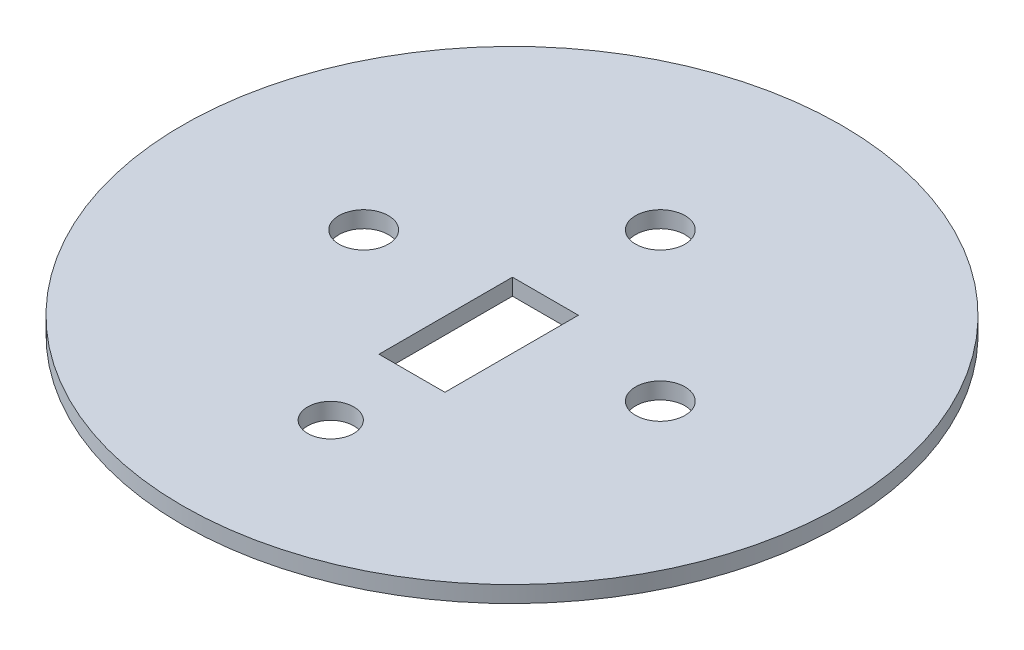
ISO-10303-21;
HEADER;
FILE_DESCRIPTION(('STEP AP214'),'2;1');
FILE_NAME('part.step','',(''),(''),'','','');
FILE_SCHEMA(('AUTOMOTIVE_DESIGN { 1 0 10303 214 1 1 1 1 }'));
ENDSEC;
DATA;
#1=APPLICATION_CONTEXT('core data for automotive mechanical design processes');
#2=APPLICATION_PROTOCOL_DEFINITION('international standard','automotive_design',2000,#1);
#3=PRODUCT_CONTEXT('',#1,'mechanical');
#4=PRODUCT('Part','Part','',(#3));
#5=PRODUCT_RELATED_PRODUCT_CATEGORY('part','',(#4));
#6=PRODUCT_DEFINITION_FORMATION('','',#4);
#7=PRODUCT_DEFINITION_CONTEXT('part definition',#1,'design');
#8=PRODUCT_DEFINITION('design','',#6,#7);
#9=PRODUCT_DEFINITION_SHAPE('','',#8);
#10=(LENGTH_UNIT() NAMED_UNIT(*) SI_UNIT(.MILLI.,.METRE.));
#11=(NAMED_UNIT(*) PLANE_ANGLE_UNIT() SI_UNIT($,.RADIAN.));
#12=(NAMED_UNIT(*) SI_UNIT($,.STERADIAN.) SOLID_ANGLE_UNIT());
#13=UNCERTAINTY_MEASURE_WITH_UNIT(LENGTH_MEASURE(1.E-05),#10,'distance_accuracy_value','');
#14=(GEOMETRIC_REPRESENTATION_CONTEXT(3) GLOBAL_UNCERTAINTY_ASSIGNED_CONTEXT((#13)) GLOBAL_UNIT_ASSIGNED_CONTEXT((#10,
#11,#12)) REPRESENTATION_CONTEXT('',''));
#15=CARTESIAN_POINT('',(0.,0.,0.));
#16=DIRECTION('',(0.,0.,1.));
#17=DIRECTION('',(1.,0.,0.));
#18=AXIS2_PLACEMENT_3D('',#15,#16,#17);
#19=CARTESIAN_POINT('',(0.,2.5,0.));
#20=DIRECTION('',(0.,-1.,0.));
#21=DIRECTION('',(0.,0.,-1.));
#22=AXIS2_PLACEMENT_3D('',#19,#20,#21);
#23=CYLINDRICAL_SURFACE('',#22,100.);
#24=CARTESIAN_POINT('',(0.,2.5,0.));
#25=DIRECTION('',(0.,1.,0.));
#26=DIRECTION('',(0.,0.,1.));
#27=AXIS2_PLACEMENT_3D('',#24,#25,#26);
#28=CIRCLE('',#27,100.);
#29=CARTESIAN_POINT('',(0.,2.5,100.));
#30=VERTEX_POINT('',#29);
#31=EDGE_CURVE('E11',#30,#30,#28,.T.);
#32=ORIENTED_EDGE('',*,*,#31,.F.);
#33=EDGE_LOOP('',(#32));
#34=FACE_BOUND('',#33,.T.);
#35=CARTESIAN_POINT('',(0.,-2.5,0.));
#36=DIRECTION('',(0.,1.,0.));
#37=DIRECTION('',(0.,0.,1.));
#38=AXIS2_PLACEMENT_3D('',#35,#36,#37);
#39=CIRCLE('',#38,100.);
#40=CARTESIAN_POINT('',(0.,-2.5,100.));
#41=VERTEX_POINT('',#40);
#42=EDGE_CURVE('E37',#41,#41,#39,.T.);
#43=ORIENTED_EDGE('',*,*,#42,.T.);
#44=EDGE_LOOP('',(#43));
#45=FACE_BOUND('',#44,.T.);
#46=ADVANCED_FACE('F34',(#34,#45),#23,.T.);
#47=CARTESIAN_POINT('',(0.,2.5,0.));
#48=DIRECTION('',(0.,1.,0.));
#49=DIRECTION('',(0.,0.,1.));
#50=AXIS2_PLACEMENT_3D('',#47,#48,#49);
#51=PLANE('',#50);
#52=CARTESIAN_POINT('',(-45.,2.5,0.));
#53=DIRECTION('',(0.,1.,0.));
#54=DIRECTION('',(0.,0.,1.));
#55=AXIS2_PLACEMENT_3D('',#52,#53,#54);
#56=CIRCLE('',#55,7.5);
#57=CARTESIAN_POINT('',(-45.,2.5,7.49999999999999));
#58=VERTEX_POINT('',#57);
#59=EDGE_CURVE('E137',#58,#58,#56,.T.);
#60=ORIENTED_EDGE('',*,*,#59,.F.);
#61=EDGE_LOOP('',(#60));
#62=FACE_BOUND('',#61,.T.);
#63=CARTESIAN_POINT('',(0.,2.5,-45.));
#64=DIRECTION('',(0.,1.,0.));
#65=DIRECTION('',(0.,0.,1.));
#66=AXIS2_PLACEMENT_3D('',#63,#64,#65);
#67=CIRCLE('',#66,7.5);
#68=CARTESIAN_POINT('',(0.,2.5,-37.5));
#69=VERTEX_POINT('',#68);
#70=EDGE_CURVE('E470',#69,#69,#67,.T.);
#71=ORIENTED_EDGE('',*,*,#70,.F.);
#72=EDGE_LOOP('',(#71));
#73=FACE_BOUND('',#72,.T.);
#74=CARTESIAN_POINT('',(45.,2.5,0.));
#75=DIRECTION('',(0.,1.,0.));
#76=DIRECTION('',(0.,0.,1.));
#77=AXIS2_PLACEMENT_3D('',#74,#75,#76);
#78=CIRCLE('',#77,7.5);
#79=CARTESIAN_POINT('',(45.,2.5,7.5));
#80=VERTEX_POINT('',#79);
#81=EDGE_CURVE('E457',#80,#80,#78,.T.);
#82=ORIENTED_EDGE('',*,*,#81,.F.);
#83=EDGE_LOOP('',(#82));
#84=FACE_BOUND('',#83,.T.);
#85=CARTESIAN_POINT('',(0.,2.5,55.));
#86=DIRECTION('',(0.,1.,0.));
#87=DIRECTION('',(0.,0.,1.));
#88=AXIS2_PLACEMENT_3D('',#85,#86,#87);
#89=CIRCLE('',#88,7.);
#90=CARTESIAN_POINT('',(0.,2.5,62.));
#91=VERTEX_POINT('',#90);
#92=EDGE_CURVE('E453',#91,#91,#89,.T.);
#93=ORIENTED_EDGE('',*,*,#92,.F.);
#94=EDGE_LOOP('',(#93));
#95=FACE_BOUND('',#94,.T.);
#96=DIRECTION('',(1.,0.,0.));
#97=VECTOR('',#96,1.);
#98=CARTESIAN_POINT('',(0.,2.5,30.36));
#99=LINE('',#98,#97);
#100=CARTESIAN_POINT('',(-9.99999999999999,2.5,30.36));
#101=VERTEX_POINT('',#100);
#102=CARTESIAN_POINT('',(10.,2.5,30.36));
#103=VERTEX_POINT('',#102);
#104=EDGE_CURVE('E157',#101,#103,#99,.T.);
#105=ORIENTED_EDGE('',*,*,#104,.F.);
#106=DIRECTION('',(0.,0.,1.));
#107=VECTOR('',#106,1.);
#108=CARTESIAN_POINT('',(-9.99999999999999,2.5,0.));
#109=LINE('',#108,#107);
#110=CARTESIAN_POINT('',(-9.99999999999999,2.5,-10.14));
#111=VERTEX_POINT('',#110);
#112=EDGE_CURVE('E150',#111,#101,#109,.T.);
#113=ORIENTED_EDGE('',*,*,#112,.F.);
#114=DIRECTION('',(-1.,0.,0.));
#115=VECTOR('',#114,1.);
#116=CARTESIAN_POINT('',(0.,2.5,-10.14));
#117=LINE('',#116,#115);
#118=CARTESIAN_POINT('',(10.,2.5,-10.14));
#119=VERTEX_POINT('',#118);
#120=EDGE_CURVE('E128',#119,#111,#117,.T.);
#121=ORIENTED_EDGE('',*,*,#120,.F.);
#122=DIRECTION('',(0.,0.,-1.));
#123=VECTOR('',#122,1.);
#124=CARTESIAN_POINT('',(10.,2.5,0.));
#125=LINE('',#124,#123);
#126=EDGE_CURVE('E155',#103,#119,#125,.T.);
#127=ORIENTED_EDGE('',*,*,#126,.F.);
#128=EDGE_LOOP('',(#105,#113,#121,#127));
#129=FACE_BOUND('',#128,.T.);
#130=ORIENTED_EDGE('',*,*,#31,.T.);
#131=EDGE_LOOP('',(#130));
#132=FACE_BOUND('',#131,.T.);
#133=ADVANCED_FACE('F249',(#62,#73,#84,#95,#129,#132),#51,.T.);
#134=CARTESIAN_POINT('',(0.,-2.5,0.));
#135=DIRECTION('',(0.,1.,0.));
#136=DIRECTION('',(0.,0.,1.));
#137=AXIS2_PLACEMENT_3D('',#134,#135,#136);
#138=PLANE('',#137);
#139=CARTESIAN_POINT('',(-45.,-2.5,0.));
#140=DIRECTION('',(0.,-1.,0.));
#141=DIRECTION('',(0.,0.,-1.));
#142=AXIS2_PLACEMENT_3D('',#139,#140,#141);
#143=CIRCLE('',#142,7.5);
#144=CARTESIAN_POINT('',(-45.,-2.5,-7.50000000000001));
#145=VERTEX_POINT('',#144);
#146=EDGE_CURVE('E452',#145,#145,#143,.T.);
#147=ORIENTED_EDGE('',*,*,#146,.F.);
#148=EDGE_LOOP('',(#147));
#149=FACE_BOUND('',#148,.T.);
#150=CARTESIAN_POINT('',(0.,-2.5,-45.));
#151=DIRECTION('',(0.,-1.,0.));
#152=DIRECTION('',(0.,0.,-1.));
#153=AXIS2_PLACEMENT_3D('',#150,#151,#152);
#154=CIRCLE('',#153,7.5);
#155=CARTESIAN_POINT('',(0.,-2.5,-52.5));
#156=VERTEX_POINT('',#155);
#157=EDGE_CURVE('E454',#156,#156,#154,.T.);
#158=ORIENTED_EDGE('',*,*,#157,.F.);
#159=EDGE_LOOP('',(#158));
#160=FACE_BOUND('',#159,.T.);
#161=CARTESIAN_POINT('',(45.,-2.5,0.));
#162=DIRECTION('',(0.,-1.,0.));
#163=DIRECTION('',(0.,0.,-1.));
#164=AXIS2_PLACEMENT_3D('',#161,#162,#163);
#165=CIRCLE('',#164,7.5);
#166=CARTESIAN_POINT('',(45.,-2.5,-7.5));
#167=VERTEX_POINT('',#166);
#168=EDGE_CURVE('E460',#167,#167,#165,.T.);
#169=ORIENTED_EDGE('',*,*,#168,.F.);
#170=EDGE_LOOP('',(#169));
#171=FACE_BOUND('',#170,.T.);
#172=CARTESIAN_POINT('',(0.,-2.5,55.));
#173=DIRECTION('',(0.,-1.,0.));
#174=DIRECTION('',(0.,0.,-1.));
#175=AXIS2_PLACEMENT_3D('',#172,#173,#174);
#176=CIRCLE('',#175,7.);
#177=CARTESIAN_POINT('',(0.,-2.5,48.));
#178=VERTEX_POINT('',#177);
#179=EDGE_CURVE('E465',#178,#178,#176,.T.);
#180=ORIENTED_EDGE('',*,*,#179,.F.);
#181=EDGE_LOOP('',(#180));
#182=FACE_BOUND('',#181,.T.);
#183=DIRECTION('',(0.,0.,-1.));
#184=VECTOR('',#183,1.);
#185=CARTESIAN_POINT('',(-9.99999999999999,-2.5,-10.14));
#186=LINE('',#185,#184);
#187=CARTESIAN_POINT('',(-9.99999999999999,-2.5,30.36));
#188=VERTEX_POINT('',#187);
#189=CARTESIAN_POINT('',(-9.99999999999999,-2.5,-10.14));
#190=VERTEX_POINT('',#189);
#191=EDGE_CURVE('E134',#188,#190,#186,.T.);
#192=ORIENTED_EDGE('',*,*,#191,.F.);
#193=DIRECTION('',(-1.,0.,0.));
#194=VECTOR('',#193,1.);
#195=CARTESIAN_POINT('',(0.,-2.5,30.36));
#196=LINE('',#195,#194);
#197=CARTESIAN_POINT('',(10.,-2.5,30.36));
#198=VERTEX_POINT('',#197);
#199=EDGE_CURVE('E56',#198,#188,#196,.T.);
#200=ORIENTED_EDGE('',*,*,#199,.F.);
#201=DIRECTION('',(0.,0.,1.));
#202=VECTOR('',#201,1.);
#203=CARTESIAN_POINT('',(10.,-2.5,30.36));
#204=LINE('',#203,#202);
#205=CARTESIAN_POINT('',(10.,-2.5,-10.14));
#206=VERTEX_POINT('',#205);
#207=EDGE_CURVE('E142',#206,#198,#204,.T.);
#208=ORIENTED_EDGE('',*,*,#207,.F.);
#209=DIRECTION('',(1.,0.,0.));
#210=VECTOR('',#209,1.);
#211=CARTESIAN_POINT('',(10.,-2.5,-10.14));
#212=LINE('',#211,#210);
#213=EDGE_CURVE('E125',#190,#206,#212,.T.);
#214=ORIENTED_EDGE('',*,*,#213,.F.);
#215=EDGE_LOOP('',(#192,#200,#208,#214));
#216=FACE_BOUND('',#215,.T.);
#217=DIRECTION('',(1.,0.,0.));
#218=VECTOR('',#217,1.);
#219=CARTESIAN_POINT('',(65.,-2.5,-50.));
#220=LINE('',#219,#218);
#221=CARTESIAN_POINT('',(55.,-2.5,-50.));
#222=VERTEX_POINT('',#221);
#223=CARTESIAN_POINT('',(65.,-2.5,-50.));
#224=VERTEX_POINT('',#223);
#225=EDGE_CURVE('E175',#222,#224,#220,.T.);
#226=ORIENTED_EDGE('',*,*,#225,.F.);
#227=DIRECTION('',(0.,0.,-1.));
#228=VECTOR('',#227,1.);
#229=CARTESIAN_POINT('',(55.,-2.5,-50.));
#230=LINE('',#229,#228);
#231=CARTESIAN_POINT('',(55.,-2.5,50.));
#232=VERTEX_POINT('',#231);
#233=EDGE_CURVE('E173',#232,#222,#230,.T.);
#234=ORIENTED_EDGE('',*,*,#233,.F.);
#235=DIRECTION('',(-1.,0.,0.));
#236=VECTOR('',#235,1.);
#237=CARTESIAN_POINT('',(55.,-2.5,50.));
#238=LINE('',#237,#236);
#239=CARTESIAN_POINT('',(65.,-2.5,50.));
#240=VERTEX_POINT('',#239);
#241=EDGE_CURVE('E164',#240,#232,#238,.T.);
#242=ORIENTED_EDGE('',*,*,#241,.F.);
#243=DIRECTION('',(0.,0.,1.));
#244=VECTOR('',#243,1.);
#245=CARTESIAN_POINT('',(65.,-2.5,50.));
#246=LINE('',#245,#244);
#247=EDGE_CURVE('E179',#224,#240,#246,.T.);
#248=ORIENTED_EDGE('',*,*,#247,.F.);
#249=EDGE_LOOP('',(#226,#234,#242,#248));
#250=FACE_BOUND('',#249,.T.);
#251=DIRECTION('',(0.,0.,-1.));
#252=VECTOR('',#251,1.);
#253=CARTESIAN_POINT('',(-65.,-2.5,0.));
#254=LINE('',#253,#252);
#255=CARTESIAN_POINT('',(-65.,-2.5,50.));
#256=VERTEX_POINT('',#255);
#257=CARTESIAN_POINT('',(-65.,-2.5,-50.));
#258=VERTEX_POINT('',#257);
#259=EDGE_CURVE('E159',#256,#258,#254,.T.);
#260=ORIENTED_EDGE('',*,*,#259,.F.);
#261=DIRECTION('',(-1.,0.,0.));
#262=VECTOR('',#261,1.);
#263=CARTESIAN_POINT('',(-55.,-2.5,50.));
#264=LINE('',#263,#262);
#265=CARTESIAN_POINT('',(-55.,-2.5,50.));
#266=VERTEX_POINT('',#265);
#267=EDGE_CURVE('E195',#266,#256,#264,.T.);
#268=ORIENTED_EDGE('',*,*,#267,.F.);
#269=DIRECTION('',(0.,0.,1.));
#270=VECTOR('',#269,1.);
#271=CARTESIAN_POINT('',(-55.,-2.5,-50.));
#272=LINE('',#271,#270);
#273=CARTESIAN_POINT('',(-55.,-2.5,-50.));
#274=VERTEX_POINT('',#273);
#275=EDGE_CURVE('E210',#274,#266,#272,.T.);
#276=ORIENTED_EDGE('',*,*,#275,.F.);
#277=DIRECTION('',(1.,0.,0.));
#278=VECTOR('',#277,1.);
#279=CARTESIAN_POINT('',(-65.,-2.5,-50.));
#280=LINE('',#279,#278);
#281=EDGE_CURVE('E207',#258,#274,#280,.T.);
#282=ORIENTED_EDGE('',*,*,#281,.F.);
#283=EDGE_LOOP('',(#260,#268,#276,#282));
#284=FACE_BOUND('',#283,.T.);
#285=ORIENTED_EDGE('',*,*,#42,.F.);
#286=EDGE_LOOP('',(#285));
#287=FACE_BOUND('',#286,.T.);
#288=ADVANCED_FACE('F139',(#149,#160,#171,#182,#216,#250,#284,#287),#138,.F.);
#289=CARTESIAN_POINT('',(-55.,0.,50.));
#290=DIRECTION('',(0.,0.,1.));
#291=DIRECTION('',(1.,0.,0.));
#292=AXIS2_PLACEMENT_3D('',#289,#290,#291);
#293=PLANE('',#292);
#294=ORIENTED_EDGE('',*,*,#267,.T.);
#295=DIRECTION('',(0.,-1.,0.));
#296=VECTOR('',#295,1.);
#297=CARTESIAN_POINT('',(-65.,0.,50.));
#298=LINE('',#297,#296);
#299=CARTESIAN_POINT('',(-65.,0.,50.));
#300=VERTEX_POINT('',#299);
#301=EDGE_CURVE('E176',#300,#256,#298,.T.);
#302=ORIENTED_EDGE('',*,*,#301,.F.);
#303=DIRECTION('',(-1.,0.,0.));
#304=VECTOR('',#303,1.);
#305=CARTESIAN_POINT('',(-55.,0.,50.));
#306=LINE('',#305,#304);
#307=CARTESIAN_POINT('',(-55.,0.,50.));
#308=VERTEX_POINT('',#307);
#309=EDGE_CURVE('E201',#308,#300,#306,.T.);
#310=ORIENTED_EDGE('',*,*,#309,.F.);
#311=DIRECTION('',(0.,-1.,0.));
#312=VECTOR('',#311,1.);
#313=CARTESIAN_POINT('',(-55.,0.,50.));
#314=LINE('',#313,#312);
#315=EDGE_CURVE('E216',#308,#266,#314,.T.);
#316=ORIENTED_EDGE('',*,*,#315,.T.);
#317=EDGE_LOOP('',(#294,#302,#310,#316));
#318=FACE_BOUND('',#317,.T.);
#319=ADVANCED_FACE('F240',(#318),#293,.F.);
#320=CARTESIAN_POINT('',(-55.,0.,-50.));
#321=DIRECTION('',(1.,0.,0.));
#322=DIRECTION('',(0.,0.,-1.));
#323=AXIS2_PLACEMENT_3D('',#320,#321,#322);
#324=PLANE('',#323);
#325=ORIENTED_EDGE('',*,*,#275,.T.);
#326=ORIENTED_EDGE('',*,*,#315,.F.);
#327=DIRECTION('',(0.,0.,1.));
#328=VECTOR('',#327,1.);
#329=CARTESIAN_POINT('',(-55.,0.,-50.));
#330=LINE('',#329,#328);
#331=CARTESIAN_POINT('',(-55.,0.,-50.));
#332=VERTEX_POINT('',#331);
#333=EDGE_CURVE('E198',#332,#308,#330,.T.);
#334=ORIENTED_EDGE('',*,*,#333,.F.);
#335=DIRECTION('',(0.,-1.,0.));
#336=VECTOR('',#335,1.);
#337=CARTESIAN_POINT('',(-55.,0.,-50.));
#338=LINE('',#337,#336);
#339=EDGE_CURVE('E218',#332,#274,#338,.T.);
#340=ORIENTED_EDGE('',*,*,#339,.T.);
#341=EDGE_LOOP('',(#325,#326,#334,#340));
#342=FACE_BOUND('',#341,.T.);
#343=ADVANCED_FACE('F234',(#342),#324,.F.);
#344=CARTESIAN_POINT('',(-65.,0.,-50.));
#345=DIRECTION('',(0.,0.,-1.));
#346=DIRECTION('',(-1.,0.,0.));
#347=AXIS2_PLACEMENT_3D('',#344,#345,#346);
#348=PLANE('',#347);
#349=ORIENTED_EDGE('',*,*,#281,.T.);
#350=ORIENTED_EDGE('',*,*,#339,.F.);
#351=DIRECTION('',(1.,0.,0.));
#352=VECTOR('',#351,1.);
#353=CARTESIAN_POINT('',(-65.,0.,-50.));
#354=LINE('',#353,#352);
#355=CARTESIAN_POINT('',(-65.,0.,-50.));
#356=VERTEX_POINT('',#355);
#357=EDGE_CURVE('E194',#356,#332,#354,.T.);
#358=ORIENTED_EDGE('',*,*,#357,.F.);
#359=DIRECTION('',(0.,-1.,0.));
#360=VECTOR('',#359,1.);
#361=CARTESIAN_POINT('',(-65.,0.,-50.));
#362=LINE('',#361,#360);
#363=EDGE_CURVE('E204',#356,#258,#362,.T.);
#364=ORIENTED_EDGE('',*,*,#363,.T.);
#365=EDGE_LOOP('',(#349,#350,#358,#364));
#366=FACE_BOUND('',#365,.T.);
#367=ADVANCED_FACE('F223',(#366),#348,.F.);
#368=CARTESIAN_POINT('',(-65.,0.,0.));
#369=DIRECTION('',(-1.,0.,0.));
#370=DIRECTION('',(0.,0.,1.));
#371=AXIS2_PLACEMENT_3D('',#368,#369,#370);
#372=PLANE('',#371);
#373=ORIENTED_EDGE('',*,*,#259,.T.);
#374=ORIENTED_EDGE('',*,*,#363,.F.);
#375=DIRECTION('',(0.,0.,-1.));
#376=VECTOR('',#375,1.);
#377=CARTESIAN_POINT('',(-65.,0.,50.));
#378=LINE('',#377,#376);
#379=EDGE_CURVE('E192',#300,#356,#378,.T.);
#380=ORIENTED_EDGE('',*,*,#379,.F.);
#381=ORIENTED_EDGE('',*,*,#301,.T.);
#382=EDGE_LOOP('',(#373,#374,#380,#381));
#383=FACE_BOUND('',#382,.T.);
#384=ADVANCED_FACE('F229',(#383),#372,.F.);
#385=CARTESIAN_POINT('',(0.,0.,0.));
#386=DIRECTION('',(0.,-1.,0.));
#387=DIRECTION('',(0.,0.,-1.));
#388=AXIS2_PLACEMENT_3D('',#385,#386,#387);
#389=PLANE('',#388);
#390=ORIENTED_EDGE('',*,*,#379,.T.);
#391=ORIENTED_EDGE('',*,*,#357,.T.);
#392=ORIENTED_EDGE('',*,*,#333,.T.);
#393=ORIENTED_EDGE('',*,*,#309,.T.);
#394=EDGE_LOOP('',(#390,#391,#392,#393));
#395=FACE_BOUND('',#394,.T.);
#396=ADVANCED_FACE('F238',(#395),#389,.T.);
#397=CARTESIAN_POINT('',(55.,0.,-50.));
#398=DIRECTION('',(-1.,0.,0.));
#399=DIRECTION('',(0.,0.,1.));
#400=AXIS2_PLACEMENT_3D('',#397,#398,#399);
#401=PLANE('',#400);
#402=ORIENTED_EDGE('',*,*,#233,.T.);
#403=DIRECTION('',(0.,-1.,0.));
#404=VECTOR('',#403,1.);
#405=CARTESIAN_POINT('',(55.,0.,-50.));
#406=LINE('',#405,#404);
#407=CARTESIAN_POINT('',(55.,0.,-50.));
#408=VERTEX_POINT('',#407);
#409=EDGE_CURVE('E172',#408,#222,#406,.T.);
#410=ORIENTED_EDGE('',*,*,#409,.F.);
#411=DIRECTION('',(0.,0.,-1.));
#412=VECTOR('',#411,1.);
#413=CARTESIAN_POINT('',(55.,0.,-50.));
#414=LINE('',#413,#412);
#415=CARTESIAN_POINT('',(55.,0.,50.));
#416=VERTEX_POINT('',#415);
#417=EDGE_CURVE('E160',#416,#408,#414,.T.);
#418=ORIENTED_EDGE('',*,*,#417,.F.);
#419=DIRECTION('',(0.,-1.,0.));
#420=VECTOR('',#419,1.);
#421=CARTESIAN_POINT('',(55.,0.,50.));
#422=LINE('',#421,#420);
#423=EDGE_CURVE('E184',#416,#232,#422,.T.);
#424=ORIENTED_EDGE('',*,*,#423,.T.);
#425=EDGE_LOOP('',(#402,#410,#418,#424));
#426=FACE_BOUND('',#425,.T.);
#427=ADVANCED_FACE('F287',(#426),#401,.F.);
#428=CARTESIAN_POINT('',(55.,0.,50.));
#429=DIRECTION('',(0.,0.,1.));
#430=DIRECTION('',(1.,0.,0.));
#431=AXIS2_PLACEMENT_3D('',#428,#429,#430);
#432=PLANE('',#431);
#433=ORIENTED_EDGE('',*,*,#241,.T.);
#434=ORIENTED_EDGE('',*,*,#423,.F.);
#435=DIRECTION('',(-1.,0.,0.));
#436=VECTOR('',#435,1.);
#437=CARTESIAN_POINT('',(55.,0.,50.));
#438=LINE('',#437,#436);
#439=CARTESIAN_POINT('',(65.,0.,50.));
#440=VERTEX_POINT('',#439);
#441=EDGE_CURVE('E169',#440,#416,#438,.T.);
#442=ORIENTED_EDGE('',*,*,#441,.F.);
#443=DIRECTION('',(0.,-1.,0.));
#444=VECTOR('',#443,1.);
#445=CARTESIAN_POINT('',(65.,0.,50.));
#446=LINE('',#445,#444);
#447=EDGE_CURVE('E186',#440,#240,#446,.T.);
#448=ORIENTED_EDGE('',*,*,#447,.T.);
#449=EDGE_LOOP('',(#433,#434,#442,#448));
#450=FACE_BOUND('',#449,.T.);
#451=ADVANCED_FACE('F293',(#450),#432,.F.);
#452=CARTESIAN_POINT('',(65.,0.,50.));
#453=DIRECTION('',(1.,0.,0.));
#454=DIRECTION('',(0.,0.,-1.));
#455=AXIS2_PLACEMENT_3D('',#452,#453,#454);
#456=PLANE('',#455);
#457=ORIENTED_EDGE('',*,*,#247,.T.);
#458=ORIENTED_EDGE('',*,*,#447,.F.);
#459=DIRECTION('',(0.,0.,1.));
#460=VECTOR('',#459,1.);
#461=CARTESIAN_POINT('',(65.,0.,0.));
#462=LINE('',#461,#460);
#463=CARTESIAN_POINT('',(65.,0.,-50.));
#464=VERTEX_POINT('',#463);
#465=EDGE_CURVE('E167',#464,#440,#462,.T.);
#466=ORIENTED_EDGE('',*,*,#465,.F.);
#467=DIRECTION('',(0.,-1.,0.));
#468=VECTOR('',#467,1.);
#469=CARTESIAN_POINT('',(65.,0.,-50.));
#470=LINE('',#469,#468);
#471=EDGE_CURVE('E188',#464,#224,#470,.T.);
#472=ORIENTED_EDGE('',*,*,#471,.T.);
#473=EDGE_LOOP('',(#457,#458,#466,#472));
#474=FACE_BOUND('',#473,.T.);
#475=ADVANCED_FACE('F301',(#474),#456,.F.);
#476=CARTESIAN_POINT('',(65.,0.,-50.));
#477=DIRECTION('',(0.,0.,-1.));
#478=DIRECTION('',(-1.,0.,0.));
#479=AXIS2_PLACEMENT_3D('',#476,#477,#478);
#480=PLANE('',#479);
#481=ORIENTED_EDGE('',*,*,#225,.T.);
#482=ORIENTED_EDGE('',*,*,#471,.F.);
#483=DIRECTION('',(1.,0.,0.));
#484=VECTOR('',#483,1.);
#485=CARTESIAN_POINT('',(65.,0.,-50.));
#486=LINE('',#485,#484);
#487=EDGE_CURVE('E163',#408,#464,#486,.T.);
#488=ORIENTED_EDGE('',*,*,#487,.F.);
#489=ORIENTED_EDGE('',*,*,#409,.T.);
#490=EDGE_LOOP('',(#481,#482,#488,#489));
#491=FACE_BOUND('',#490,.T.);
#492=ADVANCED_FACE('F309',(#491),#480,.F.);
#493=CARTESIAN_POINT('',(0.,0.,0.));
#494=DIRECTION('',(0.,1.,0.));
#495=DIRECTION('',(0.,0.,1.));
#496=AXIS2_PLACEMENT_3D('',#493,#494,#495);
#497=PLANE('',#496);
#498=ORIENTED_EDGE('',*,*,#417,.T.);
#499=ORIENTED_EDGE('',*,*,#487,.T.);
#500=ORIENTED_EDGE('',*,*,#465,.T.);
#501=ORIENTED_EDGE('',*,*,#441,.T.);
#502=EDGE_LOOP('',(#498,#499,#500,#501));
#503=FACE_BOUND('',#502,.T.);
#504=ADVANCED_FACE('F317',(#503),#497,.F.);
#505=CARTESIAN_POINT('',(0.,7.5,30.36));
#506=DIRECTION('',(0.,0.,1.));
#507=DIRECTION('',(1.,0.,0.));
#508=AXIS2_PLACEMENT_3D('',#505,#506,#507);
#509=PLANE('',#508);
#510=ORIENTED_EDGE('',*,*,#104,.T.);
#511=DIRECTION('',(0.,-1.,0.));
#512=VECTOR('',#511,1.);
#513=CARTESIAN_POINT('',(10.,7.5,30.36));
#514=LINE('',#513,#512);
#515=EDGE_CURVE('E148',#103,#198,#514,.T.);
#516=ORIENTED_EDGE('',*,*,#515,.T.);
#517=ORIENTED_EDGE('',*,*,#199,.T.);
#518=DIRECTION('',(0.,-1.,0.));
#519=VECTOR('',#518,1.);
#520=CARTESIAN_POINT('',(-9.99999999999999,7.5,30.36));
#521=LINE('',#520,#519);
#522=EDGE_CURVE('E131',#101,#188,#521,.T.);
#523=ORIENTED_EDGE('',*,*,#522,.F.);
#524=EDGE_LOOP('',(#510,#516,#517,#523));
#525=FACE_BOUND('',#524,.T.);
#526=ADVANCED_FACE('F325',(#525),#509,.F.);
#527=CARTESIAN_POINT('',(10.,7.5,30.36));
#528=DIRECTION('',(1.,0.,0.));
#529=DIRECTION('',(0.,0.,-1.));
#530=AXIS2_PLACEMENT_3D('',#527,#528,#529);
#531=PLANE('',#530);
#532=ORIENTED_EDGE('',*,*,#126,.T.);
#533=DIRECTION('',(0.,-1.,0.));
#534=VECTOR('',#533,1.);
#535=CARTESIAN_POINT('',(10.,7.5,-10.14));
#536=LINE('',#535,#534);
#537=EDGE_CURVE('E130',#119,#206,#536,.T.);
#538=ORIENTED_EDGE('',*,*,#537,.T.);
#539=ORIENTED_EDGE('',*,*,#207,.T.);
#540=ORIENTED_EDGE('',*,*,#515,.F.);
#541=EDGE_LOOP('',(#532,#538,#539,#540));
#542=FACE_BOUND('',#541,.T.);
#543=ADVANCED_FACE('F333',(#542),#531,.F.);
#544=CARTESIAN_POINT('',(10.,7.5,-10.14));
#545=DIRECTION('',(0.,0.,-1.));
#546=DIRECTION('',(-1.,0.,0.));
#547=AXIS2_PLACEMENT_3D('',#544,#545,#546);
#548=PLANE('',#547);
#549=ORIENTED_EDGE('',*,*,#120,.T.);
#550=DIRECTION('',(0.,-1.,0.));
#551=VECTOR('',#550,1.);
#552=CARTESIAN_POINT('',(-9.99999999999999,7.5,-10.14));
#553=LINE('',#552,#551);
#554=EDGE_CURVE('E48',#111,#190,#553,.T.);
#555=ORIENTED_EDGE('',*,*,#554,.T.);
#556=ORIENTED_EDGE('',*,*,#213,.T.);
#557=ORIENTED_EDGE('',*,*,#537,.F.);
#558=EDGE_LOOP('',(#549,#555,#556,#557));
#559=FACE_BOUND('',#558,.T.);
#560=ADVANCED_FACE('F122',(#559),#548,.F.);
#561=CARTESIAN_POINT('',(-9.99999999999999,7.5,-10.14));
#562=DIRECTION('',(-1.,0.,0.));
#563=DIRECTION('',(0.,0.,1.));
#564=AXIS2_PLACEMENT_3D('',#561,#562,#563);
#565=PLANE('',#564);
#566=ORIENTED_EDGE('',*,*,#112,.T.);
#567=ORIENTED_EDGE('',*,*,#522,.T.);
#568=ORIENTED_EDGE('',*,*,#191,.T.);
#569=ORIENTED_EDGE('',*,*,#554,.F.);
#570=EDGE_LOOP('',(#566,#567,#568,#569));
#571=FACE_BOUND('',#570,.T.);
#572=ADVANCED_FACE('F135',(#571),#565,.F.);
#573=CARTESIAN_POINT('',(0.,7.5,55.));
#574=DIRECTION('',(0.,-1.,0.));
#575=DIRECTION('',(0.,0.,-1.));
#576=AXIS2_PLACEMENT_3D('',#573,#574,#575);
#577=CYLINDRICAL_SURFACE('',#576,7.);
#578=ORIENTED_EDGE('',*,*,#92,.T.);
#579=EDGE_LOOP('',(#578));
#580=FACE_BOUND('',#579,.T.);
#581=ORIENTED_EDGE('',*,*,#179,.T.);
#582=EDGE_LOOP('',(#581));
#583=FACE_BOUND('',#582,.T.);
#584=ADVANCED_FACE('F352',(#580,#583),#577,.F.);
#585=CARTESIAN_POINT('',(45.,7.5,0.));
#586=DIRECTION('',(0.,-1.,0.));
#587=DIRECTION('',(0.,0.,-1.));
#588=AXIS2_PLACEMENT_3D('',#585,#586,#587);
#589=CYLINDRICAL_SURFACE('',#588,7.5);
#590=ORIENTED_EDGE('',*,*,#81,.T.);
#591=EDGE_LOOP('',(#590));
#592=FACE_BOUND('',#591,.T.);
#593=ORIENTED_EDGE('',*,*,#168,.T.);
#594=EDGE_LOOP('',(#593));
#595=FACE_BOUND('',#594,.T.);
#596=ADVANCED_FACE('F359',(#592,#595),#589,.F.);
#597=CARTESIAN_POINT('',(0.,7.5,-45.));
#598=DIRECTION('',(0.,-1.,0.));
#599=DIRECTION('',(0.,0.,-1.));
#600=AXIS2_PLACEMENT_3D('',#597,#598,#599);
#601=CYLINDRICAL_SURFACE('',#600,7.5);
#602=ORIENTED_EDGE('',*,*,#70,.T.);
#603=EDGE_LOOP('',(#602));
#604=FACE_BOUND('',#603,.T.);
#605=ORIENTED_EDGE('',*,*,#157,.T.);
#606=EDGE_LOOP('',(#605));
#607=FACE_BOUND('',#606,.T.);
#608=ADVANCED_FACE('F367',(#604,#607),#601,.F.);
#609=CARTESIAN_POINT('',(-45.,7.5,0.));
#610=DIRECTION('',(0.,-1.,0.));
#611=DIRECTION('',(0.,0.,-1.));
#612=AXIS2_PLACEMENT_3D('',#609,#610,#611);
#613=CYLINDRICAL_SURFACE('',#612,7.5);
#614=ORIENTED_EDGE('',*,*,#59,.T.);
#615=EDGE_LOOP('',(#614));
#616=FACE_BOUND('',#615,.T.);
#617=ORIENTED_EDGE('',*,*,#146,.T.);
#618=EDGE_LOOP('',(#617));
#619=FACE_BOUND('',#618,.T.);
#620=ADVANCED_FACE('F375',(#616,#619),#613,.F.);
#621=CLOSED_SHELL('',(#46,#133,#288,#319,#343,#367,#384,#396,#427,#451,#475,#492,#504,#526,#543,
#560,#572,#584,#596,#608,#620));
#622=MANIFOLD_SOLID_BREP('B2',#621);
#623=ADVANCED_BREP_SHAPE_REPRESENTATION('',(#18,#622),#14);
#624=SHAPE_DEFINITION_REPRESENTATION(#9,#623);
ENDSEC;
END-ISO-10303-21;
